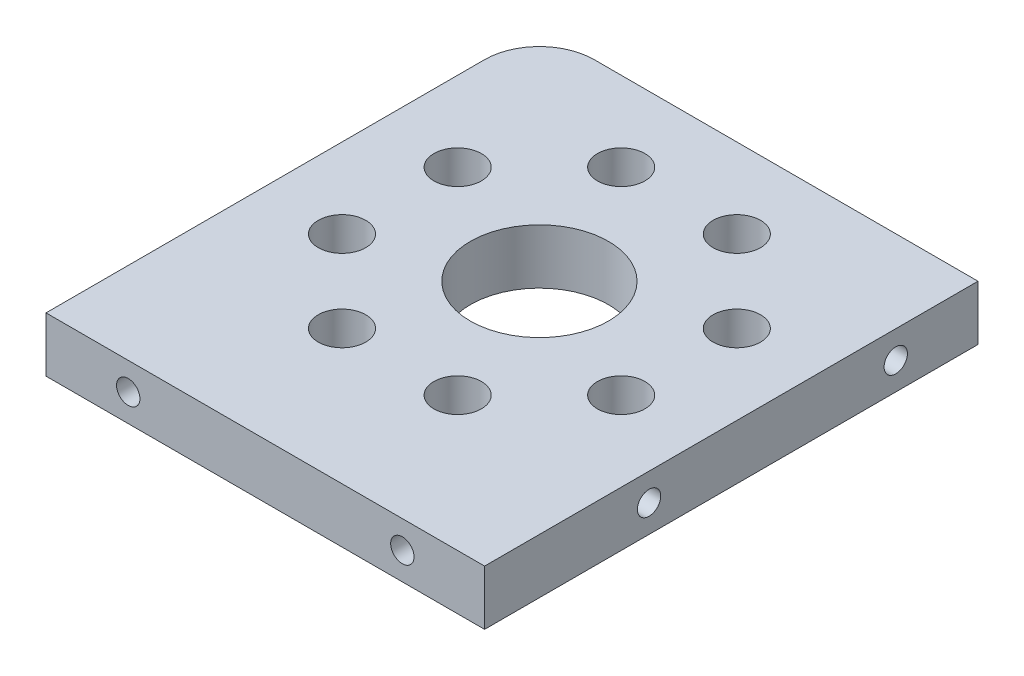
ISO-10303-21;
HEADER;
FILE_DESCRIPTION(('STEP AP214'),'2;1');
FILE_NAME('part.step','',(''),(''),'','','');
FILE_SCHEMA(('AUTOMOTIVE_DESIGN { 1 0 10303 214 1 1 1 1 }'));
ENDSEC;
DATA;
#1=APPLICATION_CONTEXT('core data for automotive mechanical design processes');
#2=APPLICATION_PROTOCOL_DEFINITION('international standard','automotive_design',2000,#1);
#3=PRODUCT_CONTEXT('',#1,'mechanical');
#4=PRODUCT('Part','Part','',(#3));
#5=PRODUCT_RELATED_PRODUCT_CATEGORY('part','',(#4));
#6=PRODUCT_DEFINITION_FORMATION('','',#4);
#7=PRODUCT_DEFINITION_CONTEXT('part definition',#1,'design');
#8=PRODUCT_DEFINITION('design','',#6,#7);
#9=PRODUCT_DEFINITION_SHAPE('','',#8);
#10=(LENGTH_UNIT() NAMED_UNIT(*) SI_UNIT(.MILLI.,.METRE.));
#11=(NAMED_UNIT(*) PLANE_ANGLE_UNIT() SI_UNIT($,.RADIAN.));
#12=(NAMED_UNIT(*) SI_UNIT($,.STERADIAN.) SOLID_ANGLE_UNIT());
#13=UNCERTAINTY_MEASURE_WITH_UNIT(LENGTH_MEASURE(1.E-05),#10,'distance_accuracy_value','');
#14=(GEOMETRIC_REPRESENTATION_CONTEXT(3) GLOBAL_UNCERTAINTY_ASSIGNED_CONTEXT((#13)) GLOBAL_UNIT_ASSIGNED_CONTEXT((#10,
#11,#12)) REPRESENTATION_CONTEXT('',''));
#15=CARTESIAN_POINT('',(0.,0.,0.));
#16=DIRECTION('',(0.,0.,1.));
#17=DIRECTION('',(1.,0.,0.));
#18=AXIS2_PLACEMENT_3D('',#15,#16,#17);
#19=CARTESIAN_POINT('',(-25.4,6.35,-28.575));
#20=DIRECTION('',(0.,0.,-1.));
#21=DIRECTION('',(-1.,0.,0.));
#22=AXIS2_PLACEMENT_3D('',#19,#20,#21);
#23=PLANE('',#22);
#24=DIRECTION('',(1.,0.,0.));
#25=VECTOR('',#24,1.);
#26=CARTESIAN_POINT('',(-25.4,0.,-28.575));
#27=LINE('',#26,#25);
#28=CARTESIAN_POINT('',(-19.05,0.,-28.575));
#29=VERTEX_POINT('',#28);
#30=CARTESIAN_POINT('',(25.4,0.,-28.575));
#31=VERTEX_POINT('',#30);
#32=EDGE_CURVE('E169',#29,#31,#27,.T.);
#33=ORIENTED_EDGE('',*,*,#32,.F.);
#34=DIRECTION('',(0.,-1.,0.));
#35=VECTOR('',#34,1.);
#36=CARTESIAN_POINT('',(-19.05,6.35,-28.575));
#37=LINE('',#36,#35);
#38=CARTESIAN_POINT('',(-19.05,6.35,-28.575));
#39=VERTEX_POINT('',#38);
#40=EDGE_CURVE('E41',#29,#39,#37,.F.);
#41=ORIENTED_EDGE('',*,*,#40,.T.);
#42=DIRECTION('',(1.,0.,0.));
#43=VECTOR('',#42,1.);
#44=CARTESIAN_POINT('',(-25.4,6.35,-28.575));
#45=LINE('',#44,#43);
#46=CARTESIAN_POINT('',(25.4,6.35,-28.575));
#47=VERTEX_POINT('',#46);
#48=EDGE_CURVE('E170',#39,#47,#45,.T.);
#49=ORIENTED_EDGE('',*,*,#48,.T.);
#50=DIRECTION('',(0.,-1.,0.));
#51=VECTOR('',#50,1.);
#52=CARTESIAN_POINT('',(25.4,6.35,-28.575));
#53=LINE('',#52,#51);
#54=EDGE_CURVE('E180',#47,#31,#53,.T.);
#55=ORIENTED_EDGE('',*,*,#54,.T.);
#56=EDGE_LOOP('',(#33,#41,#49,#55));
#57=FACE_BOUND('',#56,.T.);
#58=ADVANCED_FACE('F33',(#57),#23,.T.);
#59=CARTESIAN_POINT('',(-25.4,6.35,-28.575));
#60=DIRECTION('',(1.,0.,0.));
#61=DIRECTION('',(0.,0.,-1.));
#62=AXIS2_PLACEMENT_3D('',#59,#60,#61);
#63=PLANE('',#62);
#64=DIRECTION('',(0.,0.,1.));
#65=VECTOR('',#64,1.);
#66=CARTESIAN_POINT('',(-25.4,6.35,-28.575));
#67=LINE('',#66,#65);
#68=CARTESIAN_POINT('',(-25.4,6.35,-22.225));
#69=VERTEX_POINT('',#68);
#70=CARTESIAN_POINT('',(-25.4,6.35,28.575));
#71=VERTEX_POINT('',#70);
#72=EDGE_CURVE('E178',#69,#71,#67,.T.);
#73=ORIENTED_EDGE('',*,*,#72,.F.);
#74=DIRECTION('',(0.,-1.,0.));
#75=VECTOR('',#74,1.);
#76=CARTESIAN_POINT('',(-25.4,0.,-22.225));
#77=LINE('',#76,#75);
#78=CARTESIAN_POINT('',(-25.4,0.,-22.225));
#79=VERTEX_POINT('',#78);
#80=EDGE_CURVE('E192',#69,#79,#77,.T.);
#81=ORIENTED_EDGE('',*,*,#80,.T.);
#82=DIRECTION('',(0.,0.,1.));
#83=VECTOR('',#82,1.);
#84=CARTESIAN_POINT('',(-25.4,0.,-28.575));
#85=LINE('',#84,#83);
#86=CARTESIAN_POINT('',(-25.4,0.,28.575));
#87=VERTEX_POINT('',#86);
#88=EDGE_CURVE('E173',#79,#87,#85,.T.);
#89=ORIENTED_EDGE('',*,*,#88,.T.);
#90=DIRECTION('',(0.,-1.,0.));
#91=VECTOR('',#90,1.);
#92=CARTESIAN_POINT('',(-25.4,6.35,28.575));
#93=LINE('',#92,#91);
#94=EDGE_CURVE('E189',#71,#87,#93,.T.);
#95=ORIENTED_EDGE('',*,*,#94,.F.);
#96=EDGE_LOOP('',(#73,#81,#89,#95));
#97=FACE_BOUND('',#96,.T.);
#98=ADVANCED_FACE('F204',(#97),#63,.F.);
#99=CARTESIAN_POINT('',(-25.4,6.35,28.575));
#100=DIRECTION('',(0.,0.,-1.));
#101=DIRECTION('',(-1.,0.,0.));
#102=AXIS2_PLACEMENT_3D('',#99,#100,#101);
#103=PLANE('',#102);
#104=CARTESIAN_POINT('',(-15.875,3.175,28.575));
#105=DIRECTION('',(0.,0.,1.));
#106=DIRECTION('',(1.,0.,0.));
#107=AXIS2_PLACEMENT_3D('',#104,#105,#106);
#108=CIRCLE('',#107,1.35255);
#109=CARTESIAN_POINT('',(-14.52245,3.175,28.575));
#110=VERTEX_POINT('',#109);
#111=EDGE_CURVE('E111',#110,#110,#108,.T.);
#112=ORIENTED_EDGE('',*,*,#111,.F.);
#113=EDGE_LOOP('',(#112));
#114=FACE_BOUND('',#113,.T.);
#115=CARTESIAN_POINT('',(15.875,3.175,28.575));
#116=DIRECTION('',(0.,0.,1.));
#117=DIRECTION('',(1.,0.,0.));
#118=AXIS2_PLACEMENT_3D('',#115,#116,#117);
#119=CIRCLE('',#118,1.35255);
#120=CARTESIAN_POINT('',(17.22755,3.175,28.575));
#121=VERTEX_POINT('',#120);
#122=EDGE_CURVE('E117',#121,#121,#119,.T.);
#123=ORIENTED_EDGE('',*,*,#122,.F.);
#124=EDGE_LOOP('',(#123));
#125=FACE_BOUND('',#124,.T.);
#126=DIRECTION('',(1.,0.,0.));
#127=VECTOR('',#126,1.);
#128=CARTESIAN_POINT('',(-25.4,0.,28.575));
#129=LINE('',#128,#127);
#130=CARTESIAN_POINT('',(25.4,0.,28.575));
#131=VERTEX_POINT('',#130);
#132=EDGE_CURVE('E185',#87,#131,#129,.T.);
#133=ORIENTED_EDGE('',*,*,#132,.T.);
#134=DIRECTION('',(0.,-1.,0.));
#135=VECTOR('',#134,1.);
#136=CARTESIAN_POINT('',(25.4,6.35,28.575));
#137=LINE('',#136,#135);
#138=CARTESIAN_POINT('',(25.4,6.35,28.575));
#139=VERTEX_POINT('',#138);
#140=EDGE_CURVE('E193',#139,#131,#137,.T.);
#141=ORIENTED_EDGE('',*,*,#140,.F.);
#142=DIRECTION('',(1.,0.,0.));
#143=VECTOR('',#142,1.);
#144=CARTESIAN_POINT('',(-25.4,6.35,28.575));
#145=LINE('',#144,#143);
#146=EDGE_CURVE('E176',#71,#139,#145,.T.);
#147=ORIENTED_EDGE('',*,*,#146,.F.);
#148=ORIENTED_EDGE('',*,*,#94,.T.);
#149=EDGE_LOOP('',(#133,#141,#147,#148));
#150=FACE_BOUND('',#149,.T.);
#151=ADVANCED_FACE('F213',(#114,#125,#150),#103,.F.);
#152=CARTESIAN_POINT('',(25.4,6.35,-28.575));
#153=DIRECTION('',(1.,0.,0.));
#154=DIRECTION('',(0.,0.,-1.));
#155=AXIS2_PLACEMENT_3D('',#152,#153,#154);
#156=PLANE('',#155);
#157=CARTESIAN_POINT('',(25.4,3.175,9.52500000000001));
#158=DIRECTION('',(1.,0.,0.));
#159=DIRECTION('',(0.,0.,-1.));
#160=AXIS2_PLACEMENT_3D('',#157,#158,#159);
#161=CIRCLE('',#160,1.35254999999999);
#162=CARTESIAN_POINT('',(25.4,3.175,8.17245000000002));
#163=VERTEX_POINT('',#162);
#164=EDGE_CURVE('E99',#163,#163,#161,.T.);
#165=ORIENTED_EDGE('',*,*,#164,.F.);
#166=EDGE_LOOP('',(#165));
#167=FACE_BOUND('',#166,.T.);
#168=CARTESIAN_POINT('',(25.4,3.175,-19.05));
#169=DIRECTION('',(1.,0.,0.));
#170=DIRECTION('',(0.,0.,-1.));
#171=AXIS2_PLACEMENT_3D('',#168,#169,#170);
#172=CIRCLE('',#171,1.35254999999999);
#173=CARTESIAN_POINT('',(25.4,3.175,-20.40255));
#174=VERTEX_POINT('',#173);
#175=EDGE_CURVE('E98',#174,#174,#172,.T.);
#176=ORIENTED_EDGE('',*,*,#175,.F.);
#177=EDGE_LOOP('',(#176));
#178=FACE_BOUND('',#177,.T.);
#179=DIRECTION('',(0.,0.,1.));
#180=VECTOR('',#179,1.);
#181=CARTESIAN_POINT('',(25.4,0.,-28.575));
#182=LINE('',#181,#180);
#183=EDGE_CURVE('E182',#31,#131,#182,.T.);
#184=ORIENTED_EDGE('',*,*,#183,.F.);
#185=ORIENTED_EDGE('',*,*,#54,.F.);
#186=DIRECTION('',(0.,0.,1.));
#187=VECTOR('',#186,1.);
#188=CARTESIAN_POINT('',(25.4,6.35,-28.575));
#189=LINE('',#188,#187);
#190=EDGE_CURVE('E172',#47,#139,#189,.T.);
#191=ORIENTED_EDGE('',*,*,#190,.T.);
#192=ORIENTED_EDGE('',*,*,#140,.T.);
#193=EDGE_LOOP('',(#184,#185,#191,#192));
#194=FACE_BOUND('',#193,.T.);
#195=ADVANCED_FACE('F233',(#167,#178,#194),#156,.T.);
#196=CARTESIAN_POINT('',(0.,6.35,0.));
#197=DIRECTION('',(0.,-1.,0.));
#198=DIRECTION('',(0.,0.,-1.));
#199=AXIS2_PLACEMENT_3D('',#196,#197,#198);
#200=PLANE('',#199);
#201=CARTESIAN_POINT('',(0.,6.35,-3.17499999999999));
#202=DIRECTION('',(0.,1.,0.));
#203=DIRECTION('',(0.,0.,1.));
#204=AXIS2_PLACEMENT_3D('',#201,#202,#203);
#205=CIRCLE('',#204,8.);
#206=CARTESIAN_POINT('',(0.,6.35,4.82500000000001));
#207=VERTEX_POINT('',#206);
#208=EDGE_CURVE('E498',#207,#207,#205,.T.);
#209=ORIENTED_EDGE('',*,*,#208,.F.);
#210=EDGE_LOOP('',(#209));
#211=FACE_BOUND('',#210,.T.);
#212=CARTESIAN_POINT('',(-6.6969600663893,6.35,12.9928918189474));
#213=DIRECTION('',(0.,1.,0.));
#214=DIRECTION('',(0.,0.,1.));
#215=AXIS2_PLACEMENT_3D('',#212,#213,#214);
#216=CIRCLE('',#215,2.74999999999999);
#217=CARTESIAN_POINT('',(-6.6969600663893,6.35,15.7428918189474));
#218=VERTEX_POINT('',#217);
#219=EDGE_CURVE('E123',#218,#218,#216,.T.);
#220=ORIENTED_EDGE('',*,*,#219,.F.);
#221=EDGE_LOOP('',(#220));
#222=FACE_BOUND('',#221,.T.);
#223=CARTESIAN_POINT('',(16.1678918189474,6.35,3.52196006638927));
#224=DIRECTION('',(0.,1.,0.));
#225=DIRECTION('',(0.,0.,1.));
#226=AXIS2_PLACEMENT_3D('',#223,#224,#225);
#227=CIRCLE('',#226,2.74999999999999);
#228=CARTESIAN_POINT('',(16.1678918189474,6.35,6.27196006638925));
#229=VERTEX_POINT('',#228);
#230=EDGE_CURVE('E129',#229,#229,#227,.T.);
#231=ORIENTED_EDGE('',*,*,#230,.F.);
#232=EDGE_LOOP('',(#231));
#233=FACE_BOUND('',#232,.T.);
#234=CARTESIAN_POINT('',(-6.69696006638898,6.35,-19.3428918189475));
#235=DIRECTION('',(0.,1.,0.));
#236=DIRECTION('',(0.,0.,1.));
#237=AXIS2_PLACEMENT_3D('',#234,#235,#236);
#238=CIRCLE('',#237,2.74999999999999);
#239=CARTESIAN_POINT('',(-6.69696006638898,6.35,-16.5928918189475));
#240=VERTEX_POINT('',#239);
#241=EDGE_CURVE('E135',#240,#240,#238,.T.);
#242=ORIENTED_EDGE('',*,*,#241,.F.);
#243=EDGE_LOOP('',(#242));
#244=FACE_BOUND('',#243,.T.);
#245=CARTESIAN_POINT('',(6.69696006638898,6.35,-19.3428918189475));
#246=DIRECTION('',(0.,1.,0.));
#247=DIRECTION('',(0.,0.,1.));
#248=AXIS2_PLACEMENT_3D('',#245,#246,#247);
#249=CIRCLE('',#248,2.74999999999999);
#250=CARTESIAN_POINT('',(6.69696006638898,6.35,-16.5928918189475));
#251=VERTEX_POINT('',#250);
#252=EDGE_CURVE('E141',#251,#251,#249,.T.);
#253=ORIENTED_EDGE('',*,*,#252,.F.);
#254=EDGE_LOOP('',(#253));
#255=FACE_BOUND('',#254,.T.);
#256=CARTESIAN_POINT('',(16.1678918189476,6.35,-9.87196006638886));
#257=DIRECTION('',(0.,1.,0.));
#258=DIRECTION('',(0.,0.,1.));
#259=AXIS2_PLACEMENT_3D('',#256,#257,#258);
#260=CIRCLE('',#259,2.74999999999999);
#261=CARTESIAN_POINT('',(16.1678918189476,6.35,-7.12196006638887));
#262=VERTEX_POINT('',#261);
#263=EDGE_CURVE('E147',#262,#262,#260,.T.);
#264=ORIENTED_EDGE('',*,*,#263,.F.);
#265=EDGE_LOOP('',(#264));
#266=FACE_BOUND('',#265,.T.);
#267=CARTESIAN_POINT('',(-16.1678918189476,6.35,3.52196006638895));
#268=DIRECTION('',(0.,1.,0.));
#269=DIRECTION('',(0.,0.,1.));
#270=AXIS2_PLACEMENT_3D('',#267,#268,#269);
#271=CIRCLE('',#270,2.74999999999999);
#272=CARTESIAN_POINT('',(-16.1678918189476,6.35,6.27196006638894));
#273=VERTEX_POINT('',#272);
#274=EDGE_CURVE('E153',#273,#273,#271,.T.);
#275=ORIENTED_EDGE('',*,*,#274,.F.);
#276=EDGE_LOOP('',(#275));
#277=FACE_BOUND('',#276,.T.);
#278=CARTESIAN_POINT('',(6.69696006638904,6.35,12.9928918189475));
#279=DIRECTION('',(0.,1.,0.));
#280=DIRECTION('',(0.,0.,1.));
#281=AXIS2_PLACEMENT_3D('',#278,#279,#280);
#282=CIRCLE('',#281,2.74999999999999);
#283=CARTESIAN_POINT('',(6.69696006638904,6.35,15.7428918189475));
#284=VERTEX_POINT('',#283);
#285=EDGE_CURVE('E159',#284,#284,#282,.T.);
#286=ORIENTED_EDGE('',*,*,#285,.F.);
#287=EDGE_LOOP('',(#286));
#288=FACE_BOUND('',#287,.T.);
#289=CARTESIAN_POINT('',(-16.1678918189474,6.35,-9.87196006638933));
#290=DIRECTION('',(0.,1.,0.));
#291=DIRECTION('',(0.,0.,1.));
#292=AXIS2_PLACEMENT_3D('',#289,#290,#291);
#293=CIRCLE('',#292,2.74999999999999);
#294=CARTESIAN_POINT('',(-16.1678918189474,6.35,-7.12196006638934));
#295=VERTEX_POINT('',#294);
#296=EDGE_CURVE('E163',#295,#295,#293,.T.);
#297=ORIENTED_EDGE('',*,*,#296,.F.);
#298=EDGE_LOOP('',(#297));
#299=FACE_BOUND('',#298,.T.);
#300=ORIENTED_EDGE('',*,*,#48,.F.);
#301=CARTESIAN_POINT('',(-19.05,6.35,-22.225));
#302=DIRECTION('',(0.,-1.,0.));
#303=DIRECTION('',(0.,0.,-1.));
#304=AXIS2_PLACEMENT_3D('',#301,#302,#303);
#305=CIRCLE('',#304,6.35);
#306=EDGE_CURVE('E11',#39,#69,#305,.F.);
#307=ORIENTED_EDGE('',*,*,#306,.T.);
#308=ORIENTED_EDGE('',*,*,#72,.T.);
#309=ORIENTED_EDGE('',*,*,#146,.T.);
#310=ORIENTED_EDGE('',*,*,#190,.F.);
#311=EDGE_LOOP('',(#300,#307,#308,#309,#310));
#312=FACE_BOUND('',#311,.T.);
#313=ADVANCED_FACE('F217',(#211,#222,#233,#244,#255,#266,#277,#288,#299,#312),#200,.F.);
#314=CARTESIAN_POINT('',(0.,0.,0.));
#315=DIRECTION('',(0.,-1.,0.));
#316=DIRECTION('',(0.,0.,-1.));
#317=AXIS2_PLACEMENT_3D('',#314,#315,#316);
#318=PLANE('',#317);
#319=CARTESIAN_POINT('',(0.,0.,-3.17499999999999));
#320=DIRECTION('',(0.,1.,0.));
#321=DIRECTION('',(0.,0.,1.));
#322=AXIS2_PLACEMENT_3D('',#319,#320,#321);
#323=CIRCLE('',#322,8.);
#324=CARTESIAN_POINT('',(0.,0.,4.82500000000001));
#325=VERTEX_POINT('',#324);
#326=EDGE_CURVE('E105',#325,#325,#323,.T.);
#327=ORIENTED_EDGE('',*,*,#326,.T.);
#328=EDGE_LOOP('',(#327));
#329=FACE_BOUND('',#328,.T.);
#330=CARTESIAN_POINT('',(-6.6969600663893,0.,12.9928918189474));
#331=DIRECTION('',(0.,-1.,0.));
#332=DIRECTION('',(0.,0.,-1.));
#333=AXIS2_PLACEMENT_3D('',#330,#331,#332);
#334=CIRCLE('',#333,2.74999999999999);
#335=CARTESIAN_POINT('',(-6.6969600663893,0.,10.2428918189474));
#336=VERTEX_POINT('',#335);
#337=EDGE_CURVE('E126',#336,#336,#334,.T.);
#338=ORIENTED_EDGE('',*,*,#337,.F.);
#339=EDGE_LOOP('',(#338));
#340=FACE_BOUND('',#339,.T.);
#341=CARTESIAN_POINT('',(16.1678918189474,0.,3.52196006638927));
#342=DIRECTION('',(0.,-1.,0.));
#343=DIRECTION('',(0.,0.,-1.));
#344=AXIS2_PLACEMENT_3D('',#341,#342,#343);
#345=CIRCLE('',#344,2.74999999999999);
#346=CARTESIAN_POINT('',(16.1678918189474,0.,0.771960066389278));
#347=VERTEX_POINT('',#346);
#348=EDGE_CURVE('E132',#347,#347,#345,.T.);
#349=ORIENTED_EDGE('',*,*,#348,.F.);
#350=EDGE_LOOP('',(#349));
#351=FACE_BOUND('',#350,.T.);
#352=CARTESIAN_POINT('',(-6.69696006638898,0.,-19.3428918189475));
#353=DIRECTION('',(0.,-1.,0.));
#354=DIRECTION('',(0.,0.,-1.));
#355=AXIS2_PLACEMENT_3D('',#352,#353,#354);
#356=CIRCLE('',#355,2.74999999999999);
#357=CARTESIAN_POINT('',(-6.69696006638898,0.,-22.0928918189475));
#358=VERTEX_POINT('',#357);
#359=EDGE_CURVE('E138',#358,#358,#356,.T.);
#360=ORIENTED_EDGE('',*,*,#359,.F.);
#361=EDGE_LOOP('',(#360));
#362=FACE_BOUND('',#361,.T.);
#363=CARTESIAN_POINT('',(6.69696006638898,0.,-19.3428918189475));
#364=DIRECTION('',(0.,-1.,0.));
#365=DIRECTION('',(0.,0.,-1.));
#366=AXIS2_PLACEMENT_3D('',#363,#364,#365);
#367=CIRCLE('',#366,2.74999999999999);
#368=CARTESIAN_POINT('',(6.69696006638898,0.,-22.0928918189475));
#369=VERTEX_POINT('',#368);
#370=EDGE_CURVE('E144',#369,#369,#367,.T.);
#371=ORIENTED_EDGE('',*,*,#370,.F.);
#372=EDGE_LOOP('',(#371));
#373=FACE_BOUND('',#372,.T.);
#374=CARTESIAN_POINT('',(16.1678918189476,0.,-9.87196006638886));
#375=DIRECTION('',(0.,-1.,0.));
#376=DIRECTION('',(0.,0.,-1.));
#377=AXIS2_PLACEMENT_3D('',#374,#375,#376);
#378=CIRCLE('',#377,2.74999999999999);
#379=CARTESIAN_POINT('',(16.1678918189476,0.,-12.6219600663889));
#380=VERTEX_POINT('',#379);
#381=EDGE_CURVE('E150',#380,#380,#378,.T.);
#382=ORIENTED_EDGE('',*,*,#381,.F.);
#383=EDGE_LOOP('',(#382));
#384=FACE_BOUND('',#383,.T.);
#385=CARTESIAN_POINT('',(-16.1678918189476,0.,3.52196006638895));
#386=DIRECTION('',(0.,-1.,0.));
#387=DIRECTION('',(0.,0.,-1.));
#388=AXIS2_PLACEMENT_3D('',#385,#386,#387);
#389=CIRCLE('',#388,2.74999999999999);
#390=CARTESIAN_POINT('',(-16.1678918189476,0.,0.771960066388961));
#391=VERTEX_POINT('',#390);
#392=EDGE_CURVE('E156',#391,#391,#389,.T.);
#393=ORIENTED_EDGE('',*,*,#392,.F.);
#394=EDGE_LOOP('',(#393));
#395=FACE_BOUND('',#394,.T.);
#396=CARTESIAN_POINT('',(6.69696006638904,0.,12.9928918189475));
#397=DIRECTION('',(0.,-1.,0.));
#398=DIRECTION('',(0.,0.,-1.));
#399=AXIS2_PLACEMENT_3D('',#396,#397,#398);
#400=CIRCLE('',#399,2.74999999999999);
#401=CARTESIAN_POINT('',(6.69696006638904,0.,10.2428918189475));
#402=VERTEX_POINT('',#401);
#403=EDGE_CURVE('E162',#402,#402,#400,.T.);
#404=ORIENTED_EDGE('',*,*,#403,.F.);
#405=EDGE_LOOP('',(#404));
#406=FACE_BOUND('',#405,.T.);
#407=CARTESIAN_POINT('',(-16.1678918189474,0.,-9.87196006638933));
#408=DIRECTION('',(0.,-1.,0.));
#409=DIRECTION('',(0.,0.,-1.));
#410=AXIS2_PLACEMENT_3D('',#407,#408,#409);
#411=CIRCLE('',#410,2.74999999999999);
#412=CARTESIAN_POINT('',(-16.1678918189474,0.,-12.6219600663893));
#413=VERTEX_POINT('',#412);
#414=EDGE_CURVE('E166',#413,#413,#411,.T.);
#415=ORIENTED_EDGE('',*,*,#414,.F.);
#416=EDGE_LOOP('',(#415));
#417=FACE_BOUND('',#416,.T.);
#418=ORIENTED_EDGE('',*,*,#88,.F.);
#419=CARTESIAN_POINT('',(-19.05,0.,-22.225));
#420=DIRECTION('',(0.,-1.,0.));
#421=DIRECTION('',(0.,0.,-1.));
#422=AXIS2_PLACEMENT_3D('',#419,#420,#421);
#423=CIRCLE('',#422,6.35);
#424=EDGE_CURVE('E55',#79,#29,#423,.T.);
#425=ORIENTED_EDGE('',*,*,#424,.T.);
#426=ORIENTED_EDGE('',*,*,#32,.T.);
#427=ORIENTED_EDGE('',*,*,#183,.T.);
#428=ORIENTED_EDGE('',*,*,#132,.F.);
#429=EDGE_LOOP('',(#418,#425,#426,#427,#428));
#430=FACE_BOUND('',#429,.T.);
#431=ADVANCED_FACE('F209',(#329,#340,#351,#362,#373,#384,#395,#406,#417,#430),#318,.T.);
#432=CARTESIAN_POINT('',(-16.1678918189474,6.35,-9.87196006638933));
#433=DIRECTION('',(0.,1.,0.));
#434=DIRECTION('',(0.,0.,1.));
#435=AXIS2_PLACEMENT_3D('',#432,#433,#434);
#436=CYLINDRICAL_SURFACE('',#435,2.74999999999999);
#437=ORIENTED_EDGE('',*,*,#414,.T.);
#438=EDGE_LOOP('',(#437));
#439=FACE_BOUND('',#438,.T.);
#440=ORIENTED_EDGE('',*,*,#296,.T.);
#441=EDGE_LOOP('',(#440));
#442=FACE_BOUND('',#441,.T.);
#443=ADVANCED_FACE('F242',(#439,#442),#436,.F.);
#444=CARTESIAN_POINT('',(6.69696006638904,6.35,12.9928918189475));
#445=DIRECTION('',(0.,1.,0.));
#446=DIRECTION('',(0.,0.,1.));
#447=AXIS2_PLACEMENT_3D('',#444,#445,#446);
#448=CYLINDRICAL_SURFACE('',#447,2.74999999999999);
#449=ORIENTED_EDGE('',*,*,#403,.T.);
#450=EDGE_LOOP('',(#449));
#451=FACE_BOUND('',#450,.T.);
#452=ORIENTED_EDGE('',*,*,#285,.T.);
#453=EDGE_LOOP('',(#452));
#454=FACE_BOUND('',#453,.T.);
#455=ADVANCED_FACE('F249',(#451,#454),#448,.F.);
#456=CARTESIAN_POINT('',(-16.1678918189476,6.35,3.52196006638895));
#457=DIRECTION('',(0.,1.,0.));
#458=DIRECTION('',(0.,0.,1.));
#459=AXIS2_PLACEMENT_3D('',#456,#457,#458);
#460=CYLINDRICAL_SURFACE('',#459,2.74999999999999);
#461=ORIENTED_EDGE('',*,*,#392,.T.);
#462=EDGE_LOOP('',(#461));
#463=FACE_BOUND('',#462,.T.);
#464=ORIENTED_EDGE('',*,*,#274,.T.);
#465=EDGE_LOOP('',(#464));
#466=FACE_BOUND('',#465,.T.);
#467=ADVANCED_FACE('F253',(#463,#466),#460,.F.);
#468=CARTESIAN_POINT('',(16.1678918189476,6.35,-9.87196006638886));
#469=DIRECTION('',(0.,1.,0.));
#470=DIRECTION('',(0.,0.,1.));
#471=AXIS2_PLACEMENT_3D('',#468,#469,#470);
#472=CYLINDRICAL_SURFACE('',#471,2.74999999999999);
#473=ORIENTED_EDGE('',*,*,#381,.T.);
#474=EDGE_LOOP('',(#473));
#475=FACE_BOUND('',#474,.T.);
#476=ORIENTED_EDGE('',*,*,#263,.T.);
#477=EDGE_LOOP('',(#476));
#478=FACE_BOUND('',#477,.T.);
#479=ADVANCED_FACE('F257',(#475,#478),#472,.F.);
#480=CARTESIAN_POINT('',(6.69696006638898,6.35,-19.3428918189475));
#481=DIRECTION('',(0.,1.,0.));
#482=DIRECTION('',(0.,0.,1.));
#483=AXIS2_PLACEMENT_3D('',#480,#481,#482);
#484=CYLINDRICAL_SURFACE('',#483,2.74999999999999);
#485=ORIENTED_EDGE('',*,*,#370,.T.);
#486=EDGE_LOOP('',(#485));
#487=FACE_BOUND('',#486,.T.);
#488=ORIENTED_EDGE('',*,*,#252,.T.);
#489=EDGE_LOOP('',(#488));
#490=FACE_BOUND('',#489,.T.);
#491=ADVANCED_FACE('F261',(#487,#490),#484,.F.);
#492=CARTESIAN_POINT('',(-6.69696006638898,6.35,-19.3428918189475));
#493=DIRECTION('',(0.,1.,0.));
#494=DIRECTION('',(0.,0.,1.));
#495=AXIS2_PLACEMENT_3D('',#492,#493,#494);
#496=CYLINDRICAL_SURFACE('',#495,2.74999999999999);
#497=ORIENTED_EDGE('',*,*,#359,.T.);
#498=EDGE_LOOP('',(#497));
#499=FACE_BOUND('',#498,.T.);
#500=ORIENTED_EDGE('',*,*,#241,.T.);
#501=EDGE_LOOP('',(#500));
#502=FACE_BOUND('',#501,.T.);
#503=ADVANCED_FACE('F265',(#499,#502),#496,.F.);
#504=CARTESIAN_POINT('',(16.1678918189474,6.35,3.52196006638927));
#505=DIRECTION('',(0.,1.,0.));
#506=DIRECTION('',(0.,0.,1.));
#507=AXIS2_PLACEMENT_3D('',#504,#505,#506);
#508=CYLINDRICAL_SURFACE('',#507,2.74999999999999);
#509=ORIENTED_EDGE('',*,*,#348,.T.);
#510=EDGE_LOOP('',(#509));
#511=FACE_BOUND('',#510,.T.);
#512=ORIENTED_EDGE('',*,*,#230,.T.);
#513=EDGE_LOOP('',(#512));
#514=FACE_BOUND('',#513,.T.);
#515=ADVANCED_FACE('F269',(#511,#514),#508,.F.);
#516=CARTESIAN_POINT('',(-6.6969600663893,6.35,12.9928918189474));
#517=DIRECTION('',(0.,1.,0.));
#518=DIRECTION('',(0.,0.,1.));
#519=AXIS2_PLACEMENT_3D('',#516,#517,#518);
#520=CYLINDRICAL_SURFACE('',#519,2.74999999999999);
#521=ORIENTED_EDGE('',*,*,#337,.T.);
#522=EDGE_LOOP('',(#521));
#523=FACE_BOUND('',#522,.T.);
#524=ORIENTED_EDGE('',*,*,#219,.T.);
#525=EDGE_LOOP('',(#524));
#526=FACE_BOUND('',#525,.T.);
#527=ADVANCED_FACE('F273',(#523,#526),#520,.F.);
#528=CARTESIAN_POINT('',(15.875,3.175,15.875));
#529=DIRECTION('',(0.,0.,1.));
#530=DIRECTION('',(1.,0.,0.));
#531=AXIS2_PLACEMENT_3D('',#528,#529,#530);
#532=CONICAL_SURFACE('',#531,1.35255,1.02974425867665);
#533=CARTESIAN_POINT('',(15.875,3.175,15.0623059697343));
#534=VERTEX_POINT('',#533);
#535=VERTEX_LOOP('',#534);
#536=FACE_BOUND('',#535,.T.);
#537=CARTESIAN_POINT('',(15.875,3.175,15.875));
#538=DIRECTION('',(0.,0.,1.));
#539=DIRECTION('',(1.,0.,0.));
#540=AXIS2_PLACEMENT_3D('',#537,#538,#539);
#541=CIRCLE('',#540,1.35255);
#542=CARTESIAN_POINT('',(17.22755,3.175,15.875));
#543=VERTEX_POINT('',#542);
#544=EDGE_CURVE('E120',#543,#543,#541,.T.);
#545=ORIENTED_EDGE('',*,*,#544,.T.);
#546=EDGE_LOOP('',(#545));
#547=FACE_BOUND('',#546,.T.);
#548=ADVANCED_FACE('F277',(#536,#547),#532,.F.);
#549=CARTESIAN_POINT('',(15.875,3.175,28.575));
#550=DIRECTION('',(0.,0.,1.));
#551=DIRECTION('',(1.,0.,0.));
#552=AXIS2_PLACEMENT_3D('',#549,#550,#551);
#553=CYLINDRICAL_SURFACE('',#552,1.35255);
#554=ORIENTED_EDGE('',*,*,#544,.F.);
#555=EDGE_LOOP('',(#554));
#556=FACE_BOUND('',#555,.T.);
#557=ORIENTED_EDGE('',*,*,#122,.T.);
#558=EDGE_LOOP('',(#557));
#559=FACE_BOUND('',#558,.T.);
#560=ADVANCED_FACE('F281',(#556,#559),#553,.F.);
#561=CARTESIAN_POINT('',(-15.875,3.175,15.875));
#562=DIRECTION('',(0.,0.,1.));
#563=DIRECTION('',(1.,0.,0.));
#564=AXIS2_PLACEMENT_3D('',#561,#562,#563);
#565=CONICAL_SURFACE('',#564,1.35255,1.02974425867665);
#566=CARTESIAN_POINT('',(-15.875,3.175,15.0623059697343));
#567=VERTEX_POINT('',#566);
#568=VERTEX_LOOP('',#567);
#569=FACE_BOUND('',#568,.T.);
#570=CARTESIAN_POINT('',(-15.875,3.175,15.875));
#571=DIRECTION('',(0.,0.,1.));
#572=DIRECTION('',(1.,0.,0.));
#573=AXIS2_PLACEMENT_3D('',#570,#571,#572);
#574=CIRCLE('',#573,1.35255);
#575=CARTESIAN_POINT('',(-14.52245,3.175,15.875));
#576=VERTEX_POINT('',#575);
#577=EDGE_CURVE('E114',#576,#576,#574,.T.);
#578=ORIENTED_EDGE('',*,*,#577,.T.);
#579=EDGE_LOOP('',(#578));
#580=FACE_BOUND('',#579,.T.);
#581=ADVANCED_FACE('F285',(#569,#580),#565,.F.);
#582=CARTESIAN_POINT('',(-15.875,3.175,28.575));
#583=DIRECTION('',(0.,0.,1.));
#584=DIRECTION('',(1.,0.,0.));
#585=AXIS2_PLACEMENT_3D('',#582,#583,#584);
#586=CYLINDRICAL_SURFACE('',#585,1.35255);
#587=ORIENTED_EDGE('',*,*,#577,.F.);
#588=EDGE_LOOP('',(#587));
#589=FACE_BOUND('',#588,.T.);
#590=ORIENTED_EDGE('',*,*,#111,.T.);
#591=EDGE_LOOP('',(#590));
#592=FACE_BOUND('',#591,.T.);
#593=ADVANCED_FACE('F289',(#589,#592),#586,.F.);
#594=CARTESIAN_POINT('',(12.7,3.175,-19.05));
#595=DIRECTION('',(1.,0.,0.));
#596=DIRECTION('',(0.,0.,-1.));
#597=AXIS2_PLACEMENT_3D('',#594,#595,#596);
#598=CONICAL_SURFACE('',#597,1.35254999999999,1.02974425867665);
#599=CARTESIAN_POINT('',(11.8873059697343,3.175,-19.05));
#600=VERTEX_POINT('',#599);
#601=VERTEX_LOOP('',#600);
#602=FACE_BOUND('',#601,.T.);
#603=CARTESIAN_POINT('',(12.7,3.175,-19.05));
#604=DIRECTION('',(1.,0.,0.));
#605=DIRECTION('',(0.,0.,-1.));
#606=AXIS2_PLACEMENT_3D('',#603,#604,#605);
#607=CIRCLE('',#606,1.35254999999999);
#608=CARTESIAN_POINT('',(12.7,3.175,-20.40255));
#609=VERTEX_POINT('',#608);
#610=EDGE_CURVE('E102',#609,#609,#607,.T.);
#611=ORIENTED_EDGE('',*,*,#610,.T.);
#612=EDGE_LOOP('',(#611));
#613=FACE_BOUND('',#612,.T.);
#614=ADVANCED_FACE('F293',(#602,#613),#598,.F.);
#615=CARTESIAN_POINT('',(25.4,3.175,-19.05));
#616=DIRECTION('',(1.,0.,0.));
#617=DIRECTION('',(0.,0.,-1.));
#618=AXIS2_PLACEMENT_3D('',#615,#616,#617);
#619=CYLINDRICAL_SURFACE('',#618,1.35254999999999);
#620=ORIENTED_EDGE('',*,*,#610,.F.);
#621=EDGE_LOOP('',(#620));
#622=FACE_BOUND('',#621,.T.);
#623=ORIENTED_EDGE('',*,*,#175,.T.);
#624=EDGE_LOOP('',(#623));
#625=FACE_BOUND('',#624,.T.);
#626=ADVANCED_FACE('F92',(#622,#625),#619,.F.);
#627=CARTESIAN_POINT('',(12.7,3.175,9.52500000000001));
#628=DIRECTION('',(1.,0.,0.));
#629=DIRECTION('',(0.,0.,-1.));
#630=AXIS2_PLACEMENT_3D('',#627,#628,#629);
#631=CONICAL_SURFACE('',#630,1.35254999999999,1.02974425867665);
#632=CARTESIAN_POINT('',(11.8873059697343,3.175,9.52500000000001));
#633=VERTEX_POINT('',#632);
#634=VERTEX_LOOP('',#633);
#635=FACE_BOUND('',#634,.T.);
#636=CARTESIAN_POINT('',(12.7,3.175,9.52500000000001));
#637=DIRECTION('',(1.,0.,0.));
#638=DIRECTION('',(0.,0.,-1.));
#639=AXIS2_PLACEMENT_3D('',#636,#637,#638);
#640=CIRCLE('',#639,1.35254999999999);
#641=CARTESIAN_POINT('',(12.7,3.175,8.17245000000002));
#642=VERTEX_POINT('',#641);
#643=EDGE_CURVE('E96',#642,#642,#640,.T.);
#644=ORIENTED_EDGE('',*,*,#643,.T.);
#645=EDGE_LOOP('',(#644));
#646=FACE_BOUND('',#645,.T.);
#647=ADVANCED_FACE('F88',(#635,#646),#631,.F.);
#648=CARTESIAN_POINT('',(25.4,3.175,9.52500000000001));
#649=DIRECTION('',(1.,0.,0.));
#650=DIRECTION('',(0.,0.,-1.));
#651=AXIS2_PLACEMENT_3D('',#648,#649,#650);
#652=CYLINDRICAL_SURFACE('',#651,1.35254999999999);
#653=ORIENTED_EDGE('',*,*,#643,.F.);
#654=EDGE_LOOP('',(#653));
#655=FACE_BOUND('',#654,.T.);
#656=ORIENTED_EDGE('',*,*,#164,.T.);
#657=EDGE_LOOP('',(#656));
#658=FACE_BOUND('',#657,.T.);
#659=ADVANCED_FACE('F91',(#655,#658),#652,.F.);
#660=CARTESIAN_POINT('',(-19.05,6.35,-22.225));
#661=DIRECTION('',(0.,1.,0.));
#662=DIRECTION('',(0.,0.,1.));
#663=AXIS2_PLACEMENT_3D('',#660,#661,#662);
#664=CYLINDRICAL_SURFACE('',#663,6.35);
#665=ORIENTED_EDGE('',*,*,#306,.F.);
#666=ORIENTED_EDGE('',*,*,#40,.F.);
#667=ORIENTED_EDGE('',*,*,#424,.F.);
#668=ORIENTED_EDGE('',*,*,#80,.F.);
#669=EDGE_LOOP('',(#665,#666,#667,#668));
#670=FACE_BOUND('',#669,.T.);
#671=ADVANCED_FACE('F35',(#670),#664,.T.);
#672=CARTESIAN_POINT('',(0.,0.,-3.17499999999999));
#673=DIRECTION('',(0.,1.,0.));
#674=DIRECTION('',(0.,0.,1.));
#675=AXIS2_PLACEMENT_3D('',#672,#673,#674);
#676=CYLINDRICAL_SURFACE('',#675,8.);
#677=ORIENTED_EDGE('',*,*,#326,.F.);
#678=EDGE_LOOP('',(#677));
#679=FACE_BOUND('',#678,.T.);
#680=ORIENTED_EDGE('',*,*,#208,.T.);
#681=EDGE_LOOP('',(#680));
#682=FACE_BOUND('',#681,.T.);
#683=ADVANCED_FACE('F219',(#679,#682),#676,.F.);
#684=CLOSED_SHELL('',(#58,#98,#151,#195,#313,#431,#443,#455,#467,#479,#491,#503,#515,#527,#548,
#560,#581,#593,#614,#626,#647,#659,#671,#683));
#685=MANIFOLD_SOLID_BREP('B2',#684);
#686=ADVANCED_BREP_SHAPE_REPRESENTATION('',(#18,#685),#14);
#687=SHAPE_DEFINITION_REPRESENTATION(#9,#686);
ENDSEC;
END-ISO-10303-21;
